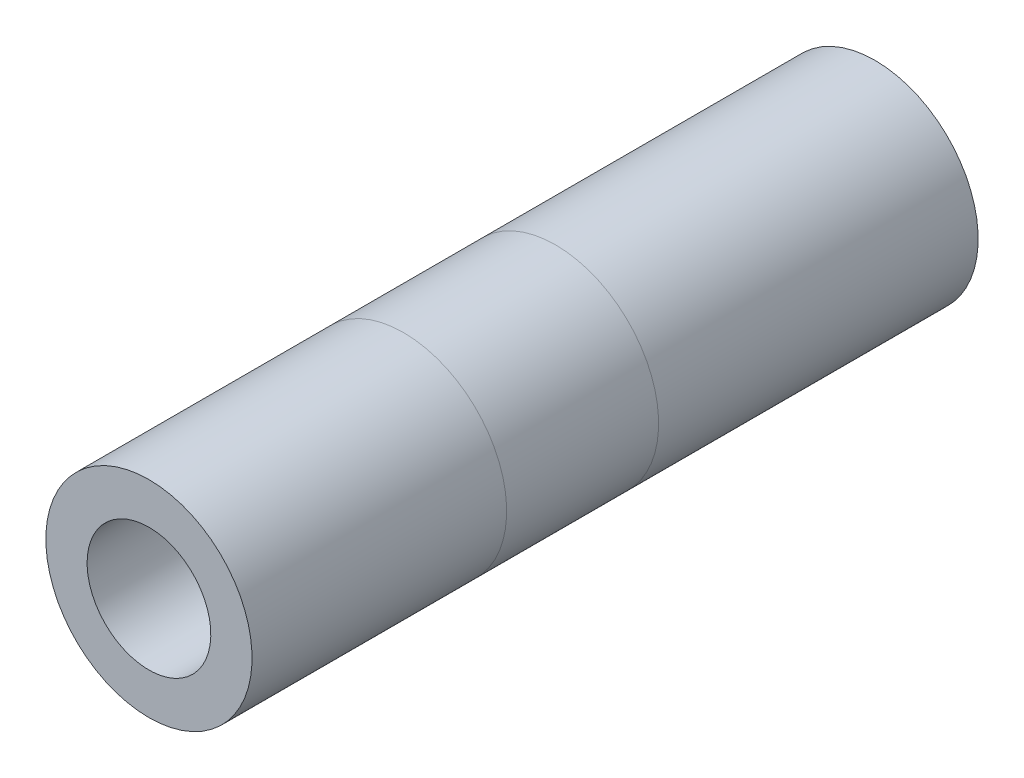
ISO-10303-21;
HEADER;
FILE_DESCRIPTION(('STEP AP214'),'2;1');
FILE_NAME('part.step','',(''),(''),'','','');
FILE_SCHEMA(('AUTOMOTIVE_DESIGN { 1 0 10303 214 1 1 1 1 }'));
ENDSEC;
DATA;
#1=APPLICATION_CONTEXT('core data for automotive mechanical design processes');
#2=APPLICATION_PROTOCOL_DEFINITION('international standard','automotive_design',2000,#1);
#3=PRODUCT_CONTEXT('',#1,'mechanical');
#4=PRODUCT('Part','Part','',(#3));
#5=PRODUCT_RELATED_PRODUCT_CATEGORY('part','',(#4));
#6=PRODUCT_DEFINITION_FORMATION('','',#4);
#7=PRODUCT_DEFINITION_CONTEXT('part definition',#1,'design');
#8=PRODUCT_DEFINITION('design','',#6,#7);
#9=PRODUCT_DEFINITION_SHAPE('','',#8);
#10=(LENGTH_UNIT() NAMED_UNIT(*) SI_UNIT(.MILLI.,.METRE.));
#11=(NAMED_UNIT(*) PLANE_ANGLE_UNIT() SI_UNIT($,.RADIAN.));
#12=(NAMED_UNIT(*) SI_UNIT($,.STERADIAN.) SOLID_ANGLE_UNIT());
#13=UNCERTAINTY_MEASURE_WITH_UNIT(LENGTH_MEASURE(1.E-05),#10,'distance_accuracy_value','');
#14=(GEOMETRIC_REPRESENTATION_CONTEXT(3) GLOBAL_UNCERTAINTY_ASSIGNED_CONTEXT((#13)) GLOBAL_UNIT_ASSIGNED_CONTEXT((#10,
#11,#12)) REPRESENTATION_CONTEXT('',''));
#15=CARTESIAN_POINT('',(0.,0.,0.));
#16=DIRECTION('',(0.,0.,1.));
#17=DIRECTION('',(1.,0.,0.));
#18=AXIS2_PLACEMENT_3D('',#15,#16,#17);
#19=CARTESIAN_POINT('',(-46.0299999999996,4.42627169165701E-13,31.3016264683147));
#20=DIRECTION('',(0.,0.,-1.));
#21=DIRECTION('',(0.,1.,0.));
#22=AXIS2_PLACEMENT_3D('',#19,#20,#21);
#23=PLANE('',#22);
#24=CARTESIAN_POINT('',(-46.0299999999996,4.42627169165701E-13,31.3016264683147));
#25=DIRECTION('',(0.,0.,-1.));
#26=DIRECTION('',(0.,1.,0.));
#27=AXIS2_PLACEMENT_3D('',#24,#25,#26);
#28=CIRCLE('',#27,4.7625);
#29=CARTESIAN_POINT('',(-46.0299999999996,4.76250000000045,31.3016264683147));
#30=VERTEX_POINT('',#29);
#31=EDGE_CURVE('E79',#30,#30,#28,.F.);
#32=ORIENTED_EDGE('',*,*,#31,.F.);
#33=EDGE_LOOP('',(#32));
#34=FACE_BOUND('',#33,.T.);
#35=CARTESIAN_POINT('',(-46.0299999999996,4.42627169165701E-13,31.3016264683147));
#36=DIRECTION('',(0.,0.,-1.));
#37=DIRECTION('',(0.,1.,0.));
#38=AXIS2_PLACEMENT_3D('',#35,#36,#37);
#39=CIRCLE('',#38,7.9375);
#40=CARTESIAN_POINT('',(-46.0299999999996,7.93750000000044,31.3016264683147));
#41=VERTEX_POINT('',#40);
#42=EDGE_CURVE('E74',#41,#41,#39,.T.);
#43=ORIENTED_EDGE('',*,*,#42,.F.);
#44=EDGE_LOOP('',(#43));
#45=FACE_BOUND('',#44,.T.);
#46=ADVANCED_FACE('F60',(#34,#45),#23,.F.);
#47=CARTESIAN_POINT('',(-46.03,0.,-24.5999999999999));
#48=DIRECTION('',(0.,0.,-1.));
#49=DIRECTION('',(0.,1.,0.));
#50=AXIS2_PLACEMENT_3D('',#47,#48,#49);
#51=PLANE('',#50);
#52=CARTESIAN_POINT('',(-46.030000000001,-1.1393832554663E-12,-24.5999999999999));
#53=DIRECTION('',(0.,0.,-1.));
#54=DIRECTION('',(0.,1.,0.));
#55=AXIS2_PLACEMENT_3D('',#52,#53,#54);
#56=CIRCLE('',#55,4.7625);
#57=CARTESIAN_POINT('',(-46.030000000001,4.76249999999886,-24.5999999999999));
#58=VERTEX_POINT('',#57);
#59=EDGE_CURVE('E80',#58,#58,#56,.F.);
#60=ORIENTED_EDGE('',*,*,#59,.T.);
#61=EDGE_LOOP('',(#60));
#62=FACE_BOUND('',#61,.T.);
#63=CARTESIAN_POINT('',(-46.03,0.,-24.5999999999999));
#64=DIRECTION('',(0.,0.,-1.));
#65=DIRECTION('',(0.,1.,0.));
#66=AXIS2_PLACEMENT_3D('',#63,#64,#65);
#67=CIRCLE('',#66,7.9375);
#68=CARTESIAN_POINT('',(-46.03,7.93750000000002,-24.5999999999999));
#69=VERTEX_POINT('',#68);
#70=EDGE_CURVE('E11',#69,#69,#67,.T.);
#71=ORIENTED_EDGE('',*,*,#70,.T.);
#72=EDGE_LOOP('',(#71));
#73=FACE_BOUND('',#72,.T.);
#74=ADVANCED_FACE('F97',(#62,#73),#51,.T.);
#75=CARTESIAN_POINT('',(-46.0299999999996,4.42627169165701E-13,31.3016264683147));
#76=DIRECTION('',(0.,0.,-1.));
#77=DIRECTION('',(-1.,0.,0.));
#78=AXIS2_PLACEMENT_3D('',#75,#76,#77);
#79=CYLINDRICAL_SURFACE('',#78,7.9375);
#80=CARTESIAN_POINT('',(-46.0299999999996,4.32834212964584E-13,11.7000469580002));
#81=DIRECTION('',(0.,0.,-1.));
#82=DIRECTION('',(0.,1.,0.));
#83=AXIS2_PLACEMENT_3D('',#80,#81,#82);
#84=CIRCLE('',#83,7.9375);
#85=CARTESIAN_POINT('',(-46.0299999999996,7.93750000000043,11.7000469580002));
#86=VERTEX_POINT('',#85);
#87=EDGE_CURVE('E70',#86,#86,#84,.T.);
#88=ORIENTED_EDGE('',*,*,#87,.F.);
#89=EDGE_LOOP('',(#88));
#90=FACE_BOUND('',#89,.T.);
#91=ORIENTED_EDGE('',*,*,#42,.T.);
#92=EDGE_LOOP('',(#91));
#93=FACE_BOUND('',#92,.T.);
#94=ADVANCED_FACE('F101',(#90,#93),#79,.T.);
#95=CARTESIAN_POINT('',(-46.0300000000006,-7.07353857110939E-13,11.7000469579987));
#96=DIRECTION('',(0.,0.,-1.));
#97=DIRECTION('',(0.,1.,0.));
#98=AXIS2_PLACEMENT_3D('',#95,#96,#97);
#99=CYLINDRICAL_SURFACE('',#98,7.9375);
#100=CARTESIAN_POINT('',(-46.030000000001,-1.13938325546625E-12,-4.66293670342566E-12));
#101=DIRECTION('',(0.,0.,-1.));
#102=DIRECTION('',(0.,1.,0.));
#103=AXIS2_PLACEMENT_3D('',#100,#101,#102);
#104=CIRCLE('',#103,7.9375);
#105=CARTESIAN_POINT('',(-46.030000000001,7.93749999999886,-4.66690228129174E-12));
#106=VERTEX_POINT('',#105);
#107=EDGE_CURVE('E66',#106,#106,#104,.T.);
#108=ORIENTED_EDGE('',*,*,#107,.F.);
#109=EDGE_LOOP('',(#108));
#110=FACE_BOUND('',#109,.T.);
#111=ORIENTED_EDGE('',*,*,#87,.T.);
#112=EDGE_LOOP('',(#111));
#113=FACE_BOUND('',#112,.T.);
#114=ADVANCED_FACE('F103',(#110,#113),#99,.T.);
#115=CARTESIAN_POINT('',(-46.03,0.,-3.09474668114262E-12));
#116=DIRECTION('',(0.,0.,-1.));
#117=DIRECTION('',(-1.,0.,0.));
#118=AXIS2_PLACEMENT_3D('',#115,#116,#117);
#119=CYLINDRICAL_SURFACE('',#118,7.9375);
#120=ORIENTED_EDGE('',*,*,#70,.F.);
#121=EDGE_LOOP('',(#120));
#122=FACE_BOUND('',#121,.T.);
#123=ORIENTED_EDGE('',*,*,#107,.T.);
#124=EDGE_LOOP('',(#123));
#125=FACE_BOUND('',#124,.T.);
#126=ADVANCED_FACE('F110',(#122,#125),#119,.T.);
#127=CARTESIAN_POINT('',(-46.030000000001,-1.1393832554663E-12,-4.64905891561784E-12));
#128=DIRECTION('',(0.,0.,-1.));
#129=DIRECTION('',(-1.,0.,0.));
#130=AXIS2_PLACEMENT_3D('',#127,#128,#129);
#131=CYLINDRICAL_SURFACE('',#130,4.7625);
#132=CARTESIAN_POINT('',(-46.0300000000011,-1.1393832554663E-12,-4.69763117294519E-12));
#133=DIRECTION('',(0.,0.,-1.));
#134=DIRECTION('',(0.,1.,0.));
#135=AXIS2_PLACEMENT_3D('',#132,#133,#134);
#136=CIRCLE('',#135,4.7625);
#137=CARTESIAN_POINT('',(-46.0300000000011,4.76249999999886,-4.70001051966484E-12));
#138=VERTEX_POINT('',#137);
#139=EDGE_CURVE('E84',#138,#138,#136,.T.);
#140=ORIENTED_EDGE('',*,*,#139,.F.);
#141=EDGE_LOOP('',(#140));
#142=FACE_BOUND('',#141,.T.);
#143=ORIENTED_EDGE('',*,*,#59,.F.);
#144=EDGE_LOOP('',(#143));
#145=FACE_BOUND('',#144,.T.);
#146=ADVANCED_FACE('F98',(#142,#145),#131,.F.);
#147=CARTESIAN_POINT('',(-46.0299999999996,4.43126769526782E-13,32.3016264683147));
#148=DIRECTION('',(0.,0.,-1.));
#149=DIRECTION('',(-1.,0.,0.));
#150=AXIS2_PLACEMENT_3D('',#147,#148,#149);
#151=CYLINDRICAL_SURFACE('',#150,4.7625);
#152=ORIENTED_EDGE('',*,*,#31,.T.);
#153=EDGE_LOOP('',(#152));
#154=FACE_BOUND('',#153,.T.);
#155=CARTESIAN_POINT('',(-46.0299999999996,4.32834212964584E-13,11.7000469580002));
#156=DIRECTION('',(0.,0.,-1.));
#157=DIRECTION('',(0.,1.,0.));
#158=AXIS2_PLACEMENT_3D('',#155,#156,#157);
#159=CIRCLE('',#158,4.7625);
#160=CARTESIAN_POINT('',(-46.0299999999996,4.76250000000044,11.7000469580001));
#161=VERTEX_POINT('',#160);
#162=EDGE_CURVE('E83',#161,#161,#159,.T.);
#163=ORIENTED_EDGE('',*,*,#162,.T.);
#164=EDGE_LOOP('',(#163));
#165=FACE_BOUND('',#164,.T.);
#166=ADVANCED_FACE('F92',(#154,#165),#151,.F.);
#167=CARTESIAN_POINT('',(-46.0300000000007,-7.07353857110997E-13,11.7000469579986));
#168=DIRECTION('',(0.,0.,-1.));
#169=DIRECTION('',(0.,1.,0.));
#170=AXIS2_PLACEMENT_3D('',#167,#168,#169);
#171=CYLINDRICAL_SURFACE('',#170,4.7625);
#172=ORIENTED_EDGE('',*,*,#139,.T.);
#173=EDGE_LOOP('',(#172));
#174=FACE_BOUND('',#173,.T.);
#175=ORIENTED_EDGE('',*,*,#162,.F.);
#176=EDGE_LOOP('',(#175));
#177=FACE_BOUND('',#176,.T.);
#178=ADVANCED_FACE('F123',(#174,#177),#171,.F.);
#179=CLOSED_SHELL('',(#46,#74,#94,#114,#126,#146,#166,#178));
#180=MANIFOLD_SOLID_BREP('B2',#179);
#181=ADVANCED_BREP_SHAPE_REPRESENTATION('',(#18,#180),#14);
#182=SHAPE_DEFINITION_REPRESENTATION(#9,#181);
ENDSEC;
END-ISO-10303-21;
